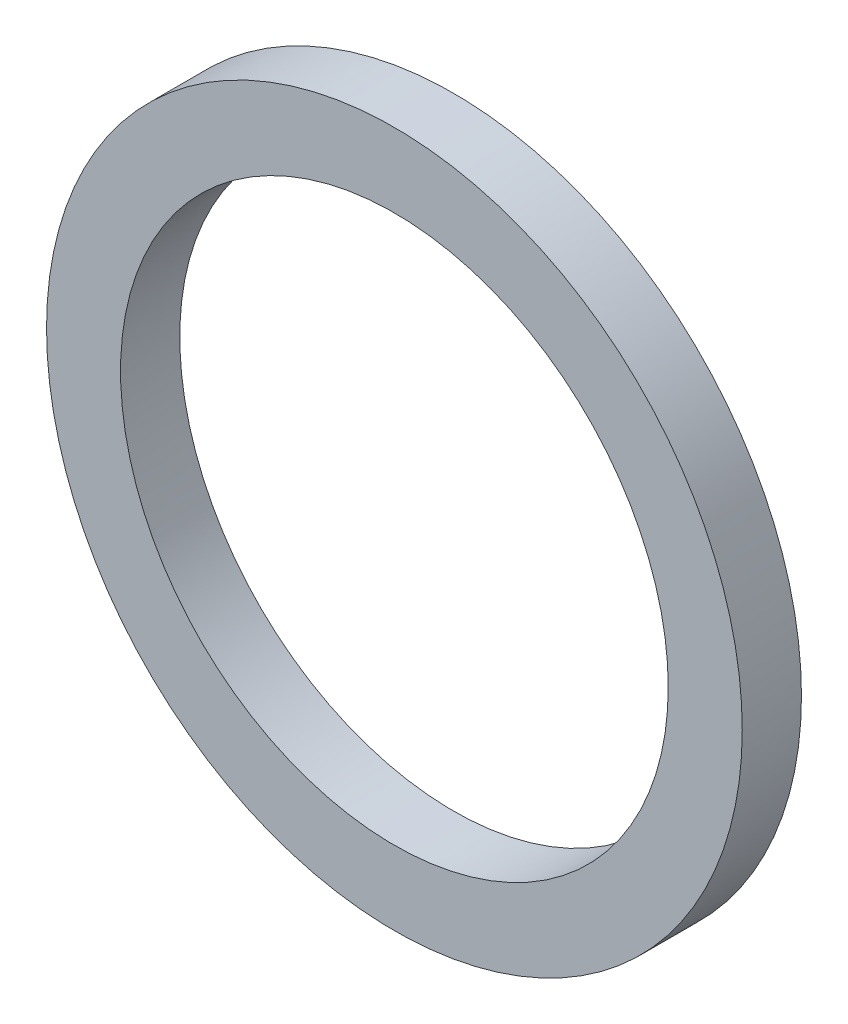
ISO-10303-21;
HEADER;
FILE_DESCRIPTION(('STEP AP214'),'2;1');
FILE_NAME('part.step','',(''),(''),'','','');
FILE_SCHEMA(('AUTOMOTIVE_DESIGN { 1 0 10303 214 1 1 1 1 }'));
ENDSEC;
DATA;
#1=APPLICATION_CONTEXT('core data for automotive mechanical design processes');
#2=APPLICATION_PROTOCOL_DEFINITION('international standard','automotive_design',2000,#1);
#3=PRODUCT_CONTEXT('',#1,'mechanical');
#4=PRODUCT('Part','Part','',(#3));
#5=PRODUCT_RELATED_PRODUCT_CATEGORY('part','',(#4));
#6=PRODUCT_DEFINITION_FORMATION('','',#4);
#7=PRODUCT_DEFINITION_CONTEXT('part definition',#1,'design');
#8=PRODUCT_DEFINITION('design','',#6,#7);
#9=PRODUCT_DEFINITION_SHAPE('','',#8);
#10=(LENGTH_UNIT() NAMED_UNIT(*) SI_UNIT(.MILLI.,.METRE.));
#11=(NAMED_UNIT(*) PLANE_ANGLE_UNIT() SI_UNIT($,.RADIAN.));
#12=(NAMED_UNIT(*) SI_UNIT($,.STERADIAN.) SOLID_ANGLE_UNIT());
#13=UNCERTAINTY_MEASURE_WITH_UNIT(LENGTH_MEASURE(1.E-05),#10,'distance_accuracy_value','');
#14=(GEOMETRIC_REPRESENTATION_CONTEXT(3) GLOBAL_UNCERTAINTY_ASSIGNED_CONTEXT((#13)) GLOBAL_UNIT_ASSIGNED_CONTEXT((#10,
#11,#12)) REPRESENTATION_CONTEXT('',''));
#15=CARTESIAN_POINT('',(0.,0.,0.));
#16=DIRECTION('',(0.,0.,1.));
#17=DIRECTION('',(1.,0.,0.));
#18=AXIS2_PLACEMENT_3D('',#15,#16,#17);
#19=CARTESIAN_POINT('',(0.,0.,4.));
#20=DIRECTION('',(0.,0.,1.));
#21=DIRECTION('',(1.,0.,0.));
#22=AXIS2_PLACEMENT_3D('',#19,#20,#21);
#23=PLANE('',#22);
#24=CARTESIAN_POINT('',(0.,0.,4.));
#25=DIRECTION('',(0.,0.,1.));
#26=DIRECTION('',(1.,0.,0.));
#27=AXIS2_PLACEMENT_3D('',#24,#25,#26);
#28=CIRCLE('',#27,23.5);
#29=CARTESIAN_POINT('',(23.5,0.,4.));
#30=VERTEX_POINT('',#29);
#31=EDGE_CURVE('E10',#30,#30,#28,.T.);
#32=ORIENTED_EDGE('',*,*,#31,.T.);
#33=EDGE_LOOP('',(#32));
#34=FACE_BOUND('',#33,.T.);
#35=CARTESIAN_POINT('',(0.,0.,4.));
#36=DIRECTION('',(0.,0.,1.));
#37=DIRECTION('',(1.,0.,0.));
#38=AXIS2_PLACEMENT_3D('',#35,#36,#37);
#39=CIRCLE('',#38,18.5);
#40=CARTESIAN_POINT('',(18.5,0.,4.));
#41=VERTEX_POINT('',#40);
#42=EDGE_CURVE('E50',#41,#41,#39,.T.);
#43=ORIENTED_EDGE('',*,*,#42,.F.);
#44=EDGE_LOOP('',(#43));
#45=FACE_BOUND('',#44,.T.);
#46=ADVANCED_FACE('F37',(#34,#45),#23,.T.);
#47=CARTESIAN_POINT('',(0.,0.,0.));
#48=DIRECTION('',(0.,0.,1.));
#49=DIRECTION('',(1.,0.,0.));
#50=AXIS2_PLACEMENT_3D('',#47,#48,#49);
#51=PLANE('',#50);
#52=CARTESIAN_POINT('',(0.,0.,0.));
#53=DIRECTION('',(0.,0.,1.));
#54=DIRECTION('',(1.,0.,0.));
#55=AXIS2_PLACEMENT_3D('',#52,#53,#54);
#56=CIRCLE('',#55,23.5);
#57=CARTESIAN_POINT('',(23.5,0.,0.));
#58=VERTEX_POINT('',#57);
#59=EDGE_CURVE('E41',#58,#58,#56,.T.);
#60=ORIENTED_EDGE('',*,*,#59,.F.);
#61=EDGE_LOOP('',(#60));
#62=FACE_BOUND('',#61,.T.);
#63=CARTESIAN_POINT('',(0.,0.,0.));
#64=DIRECTION('',(0.,0.,1.));
#65=DIRECTION('',(1.,0.,0.));
#66=AXIS2_PLACEMENT_3D('',#63,#64,#65);
#67=CIRCLE('',#66,18.5);
#68=CARTESIAN_POINT('',(18.5,0.,0.));
#69=VERTEX_POINT('',#68);
#70=EDGE_CURVE('E52',#69,#69,#67,.T.);
#71=ORIENTED_EDGE('',*,*,#70,.T.);
#72=EDGE_LOOP('',(#71));
#73=FACE_BOUND('',#72,.T.);
#74=ADVANCED_FACE('F64',(#62,#73),#51,.F.);
#75=CARTESIAN_POINT('',(0.,0.,4.));
#76=DIRECTION('',(0.,0.,-1.));
#77=DIRECTION('',(-1.,0.,0.));
#78=AXIS2_PLACEMENT_3D('',#75,#76,#77);
#79=CYLINDRICAL_SURFACE('',#78,23.5);
#80=ORIENTED_EDGE('',*,*,#31,.F.);
#81=EDGE_LOOP('',(#80));
#82=FACE_BOUND('',#81,.T.);
#83=ORIENTED_EDGE('',*,*,#59,.T.);
#84=EDGE_LOOP('',(#83));
#85=FACE_BOUND('',#84,.T.);
#86=ADVANCED_FACE('F39',(#82,#85),#79,.T.);
#87=CARTESIAN_POINT('',(0.,0.,4.));
#88=DIRECTION('',(0.,0.,-1.));
#89=DIRECTION('',(-1.,0.,0.));
#90=AXIS2_PLACEMENT_3D('',#87,#88,#89);
#91=CYLINDRICAL_SURFACE('',#90,18.5);
#92=ORIENTED_EDGE('',*,*,#42,.T.);
#93=EDGE_LOOP('',(#92));
#94=FACE_BOUND('',#93,.T.);
#95=ORIENTED_EDGE('',*,*,#70,.F.);
#96=EDGE_LOOP('',(#95));
#97=FACE_BOUND('',#96,.T.);
#98=ADVANCED_FACE('F60',(#94,#97),#91,.F.);
#99=CLOSED_SHELL('',(#46,#74,#86,#98));
#100=MANIFOLD_SOLID_BREP('B2',#99);
#101=ADVANCED_BREP_SHAPE_REPRESENTATION('',(#18,#100),#14);
#102=SHAPE_DEFINITION_REPRESENTATION(#9,#101);
ENDSEC;
END-ISO-10303-21;
